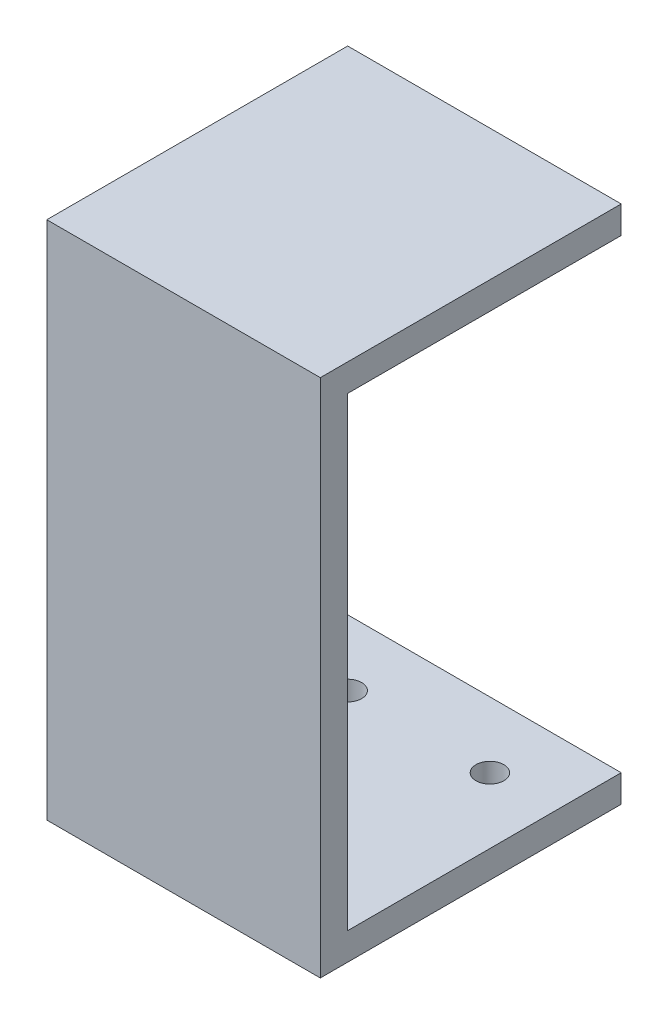
ISO-10303-21;
HEADER;
FILE_DESCRIPTION(('STEP AP214'),'2;1');
FILE_NAME('part.step','',(''),(''),'','','');
FILE_SCHEMA(('AUTOMOTIVE_DESIGN { 1 0 10303 214 1 1 1 1 }'));
ENDSEC;
DATA;
#1=APPLICATION_CONTEXT('core data for automotive mechanical design processes');
#2=APPLICATION_PROTOCOL_DEFINITION('international standard','automotive_design',2000,#1);
#3=PRODUCT_CONTEXT('',#1,'mechanical');
#4=PRODUCT('Part','Part','',(#3));
#5=PRODUCT_RELATED_PRODUCT_CATEGORY('part','',(#4));
#6=PRODUCT_DEFINITION_FORMATION('','',#4);
#7=PRODUCT_DEFINITION_CONTEXT('part definition',#1,'design');
#8=PRODUCT_DEFINITION('design','',#6,#7);
#9=PRODUCT_DEFINITION_SHAPE('','',#8);
#10=(LENGTH_UNIT() NAMED_UNIT(*) SI_UNIT(.MILLI.,.METRE.));
#11=(NAMED_UNIT(*) PLANE_ANGLE_UNIT() SI_UNIT($,.RADIAN.));
#12=(NAMED_UNIT(*) SI_UNIT($,.STERADIAN.) SOLID_ANGLE_UNIT());
#13=UNCERTAINTY_MEASURE_WITH_UNIT(LENGTH_MEASURE(1.E-05),#10,'distance_accuracy_value','');
#14=(GEOMETRIC_REPRESENTATION_CONTEXT(3) GLOBAL_UNCERTAINTY_ASSIGNED_CONTEXT((#13)) GLOBAL_UNIT_ASSIGNED_CONTEXT((#10,
#11,#12)) REPRESENTATION_CONTEXT('',''));
#15=CARTESIAN_POINT('',(0.,0.,0.));
#16=DIRECTION('',(0.,0.,1.));
#17=DIRECTION('',(1.,0.,0.));
#18=AXIS2_PLACEMENT_3D('',#15,#16,#17);
#19=CARTESIAN_POINT('',(0.,0.,0.));
#20=DIRECTION('',(0.,0.,1.));
#21=DIRECTION('',(1.,0.,0.));
#22=AXIS2_PLACEMENT_3D('',#19,#20,#21);
#23=PLANE('',#22);
#24=DIRECTION('',(-1.,0.,0.));
#25=VECTOR('',#24,1.);
#26=CARTESIAN_POINT('',(25.,42.52,0.));
#27=LINE('',#26,#25);
#28=CARTESIAN_POINT('',(25.,42.52,0.));
#29=VERTEX_POINT('',#28);
#30=CARTESIAN_POINT('',(-25.,42.52,0.));
#31=VERTEX_POINT('',#30);
#32=EDGE_CURVE('E61',#29,#31,#27,.T.);
#33=ORIENTED_EDGE('',*,*,#32,.F.);
#34=DIRECTION('',(0.,1.,0.));
#35=VECTOR('',#34,1.);
#36=CARTESIAN_POINT('',(25.,47.52,0.));
#37=LINE('',#36,#35);
#38=CARTESIAN_POINT('',(25.,-42.52,0.));
#39=VERTEX_POINT('',#38);
#40=EDGE_CURVE('E129',#39,#29,#37,.T.);
#41=ORIENTED_EDGE('',*,*,#40,.F.);
#42=DIRECTION('',(1.,0.,0.));
#43=VECTOR('',#42,1.);
#44=CARTESIAN_POINT('',(25.,-42.52,0.));
#45=LINE('',#44,#43);
#46=CARTESIAN_POINT('',(-25.,-42.52,0.));
#47=VERTEX_POINT('',#46);
#48=EDGE_CURVE('E56',#47,#39,#45,.T.);
#49=ORIENTED_EDGE('',*,*,#48,.F.);
#50=DIRECTION('',(0.,-1.,0.));
#51=VECTOR('',#50,1.);
#52=CARTESIAN_POINT('',(-25.,47.52,0.));
#53=LINE('',#52,#51);
#54=EDGE_CURVE('E132',#31,#47,#53,.T.);
#55=ORIENTED_EDGE('',*,*,#54,.F.);
#56=EDGE_LOOP('',(#33,#41,#49,#55));
#57=FACE_BOUND('',#56,.T.);
#58=ADVANCED_FACE('F43',(#57),#23,.F.);
#59=CARTESIAN_POINT('',(25.,47.52,5.));
#60=DIRECTION('',(-1.,0.,0.));
#61=DIRECTION('',(0.,-1.,0.));
#62=AXIS2_PLACEMENT_3D('',#59,#60,#61);
#63=PLANE('',#62);
#64=DIRECTION('',(0.,0.,-1.));
#65=VECTOR('',#64,1.);
#66=CARTESIAN_POINT('',(25.,-47.52,5.));
#67=LINE('',#66,#65);
#68=CARTESIAN_POINT('',(25.,-47.52,5.));
#69=VERTEX_POINT('',#68);
#70=CARTESIAN_POINT('',(25.,-47.52,-50.));
#71=VERTEX_POINT('',#70);
#72=EDGE_CURVE('E161',#69,#71,#67,.T.);
#73=ORIENTED_EDGE('',*,*,#72,.T.);
#74=DIRECTION('',(0.,-1.,0.));
#75=VECTOR('',#74,1.);
#76=CARTESIAN_POINT('',(25.,-47.52,-50.));
#77=LINE('',#76,#75);
#78=CARTESIAN_POINT('',(25.,-42.52,-50.));
#79=VERTEX_POINT('',#78);
#80=EDGE_CURVE('E142',#79,#71,#77,.T.);
#81=ORIENTED_EDGE('',*,*,#80,.F.);
#82=DIRECTION('',(0.,0.,1.));
#83=VECTOR('',#82,1.);
#84=CARTESIAN_POINT('',(25.,-42.52,-50.));
#85=LINE('',#84,#83);
#86=EDGE_CURVE('E137',#79,#39,#85,.T.);
#87=ORIENTED_EDGE('',*,*,#86,.T.);
#88=ORIENTED_EDGE('',*,*,#40,.T.);
#89=DIRECTION('',(0.,0.,1.));
#90=VECTOR('',#89,1.);
#91=CARTESIAN_POINT('',(25.,42.52,-50.));
#92=LINE('',#91,#90);
#93=CARTESIAN_POINT('',(25.,42.52,-50.));
#94=VERTEX_POINT('',#93);
#95=EDGE_CURVE('E112',#94,#29,#92,.T.);
#96=ORIENTED_EDGE('',*,*,#95,.F.);
#97=DIRECTION('',(0.,-1.,0.));
#98=VECTOR('',#97,1.);
#99=CARTESIAN_POINT('',(25.,47.52,-50.));
#100=LINE('',#99,#98);
#101=CARTESIAN_POINT('',(25.,47.52,-50.));
#102=VERTEX_POINT('',#101);
#103=EDGE_CURVE('E120',#102,#94,#100,.T.);
#104=ORIENTED_EDGE('',*,*,#103,.F.);
#105=DIRECTION('',(0.,0.,-1.));
#106=VECTOR('',#105,1.);
#107=CARTESIAN_POINT('',(25.,47.52,5.));
#108=LINE('',#107,#106);
#109=CARTESIAN_POINT('',(25.,47.52,5.));
#110=VERTEX_POINT('',#109);
#111=EDGE_CURVE('E11',#110,#102,#108,.T.);
#112=ORIENTED_EDGE('',*,*,#111,.F.);
#113=DIRECTION('',(0.,1.,0.));
#114=VECTOR('',#113,1.);
#115=CARTESIAN_POINT('',(25.,47.52,5.));
#116=LINE('',#115,#114);
#117=EDGE_CURVE('E153',#69,#110,#116,.T.);
#118=ORIENTED_EDGE('',*,*,#117,.F.);
#119=EDGE_LOOP('',(#73,#81,#87,#88,#96,#104,#112,#118));
#120=FACE_BOUND('',#119,.T.);
#121=ADVANCED_FACE('F44',(#120),#63,.F.);
#122=CARTESIAN_POINT('',(-25.,47.52,5.));
#123=DIRECTION('',(0.,-1.,0.));
#124=DIRECTION('',(0.,0.,-1.));
#125=AXIS2_PLACEMENT_3D('',#122,#123,#124);
#126=PLANE('',#125);
#127=ORIENTED_EDGE('',*,*,#111,.T.);
#128=DIRECTION('',(1.,0.,0.));
#129=VECTOR('',#128,1.);
#130=CARTESIAN_POINT('',(25.,47.52,-50.));
#131=LINE('',#130,#129);
#132=CARTESIAN_POINT('',(-25.,47.52,-50.));
#133=VERTEX_POINT('',#132);
#134=EDGE_CURVE('E122',#133,#102,#131,.T.);
#135=ORIENTED_EDGE('',*,*,#134,.F.);
#136=DIRECTION('',(0.,0.,-1.));
#137=VECTOR('',#136,1.);
#138=CARTESIAN_POINT('',(-25.,47.52,5.));
#139=LINE('',#138,#137);
#140=CARTESIAN_POINT('',(-25.,47.52,5.));
#141=VERTEX_POINT('',#140);
#142=EDGE_CURVE('E55',#141,#133,#139,.T.);
#143=ORIENTED_EDGE('',*,*,#142,.F.);
#144=DIRECTION('',(-1.,0.,0.));
#145=VECTOR('',#144,1.);
#146=CARTESIAN_POINT('',(-25.,47.52,5.));
#147=LINE('',#146,#145);
#148=EDGE_CURVE('E156',#110,#141,#147,.T.);
#149=ORIENTED_EDGE('',*,*,#148,.F.);
#150=EDGE_LOOP('',(#127,#135,#143,#149));
#151=FACE_BOUND('',#150,.T.);
#152=ADVANCED_FACE('F171',(#151),#126,.F.);
#153=CARTESIAN_POINT('',(-25.,47.52,5.));
#154=DIRECTION('',(1.,0.,0.));
#155=DIRECTION('',(0.,1.,0.));
#156=AXIS2_PLACEMENT_3D('',#153,#154,#155);
#157=PLANE('',#156);
#158=ORIENTED_EDGE('',*,*,#142,.T.);
#159=DIRECTION('',(0.,1.,0.));
#160=VECTOR('',#159,1.);
#161=CARTESIAN_POINT('',(-25.,47.52,-50.));
#162=LINE('',#161,#160);
#163=CARTESIAN_POINT('',(-25.,42.52,-50.));
#164=VERTEX_POINT('',#163);
#165=EDGE_CURVE('E119',#164,#133,#162,.T.);
#166=ORIENTED_EDGE('',*,*,#165,.F.);
#167=DIRECTION('',(0.,0.,1.));
#168=VECTOR('',#167,1.);
#169=CARTESIAN_POINT('',(-25.,42.52,-50.));
#170=LINE('',#169,#168);
#171=EDGE_CURVE('E114',#164,#31,#170,.T.);
#172=ORIENTED_EDGE('',*,*,#171,.T.);
#173=ORIENTED_EDGE('',*,*,#54,.T.);
#174=DIRECTION('',(0.,0.,1.));
#175=VECTOR('',#174,1.);
#176=CARTESIAN_POINT('',(-25.,-42.52,-50.));
#177=LINE('',#176,#175);
#178=CARTESIAN_POINT('',(-25.,-42.52,-50.));
#179=VERTEX_POINT('',#178);
#180=EDGE_CURVE('E136',#179,#47,#177,.T.);
#181=ORIENTED_EDGE('',*,*,#180,.F.);
#182=DIRECTION('',(0.,1.,0.));
#183=VECTOR('',#182,1.);
#184=CARTESIAN_POINT('',(-25.,-47.52,-50.));
#185=LINE('',#184,#183);
#186=CARTESIAN_POINT('',(-25.,-47.52,-50.));
#187=VERTEX_POINT('',#186);
#188=EDGE_CURVE('E149',#187,#179,#185,.T.);
#189=ORIENTED_EDGE('',*,*,#188,.F.);
#190=DIRECTION('',(0.,0.,-1.));
#191=VECTOR('',#190,1.);
#192=CARTESIAN_POINT('',(-25.,-47.52,5.));
#193=LINE('',#192,#191);
#194=CARTESIAN_POINT('',(-25.,-47.52,5.));
#195=VERTEX_POINT('',#194);
#196=EDGE_CURVE('E164',#195,#187,#193,.T.);
#197=ORIENTED_EDGE('',*,*,#196,.F.);
#198=DIRECTION('',(0.,-1.,0.));
#199=VECTOR('',#198,1.);
#200=CARTESIAN_POINT('',(-25.,47.52,5.));
#201=LINE('',#200,#199);
#202=EDGE_CURVE('E158',#141,#195,#201,.T.);
#203=ORIENTED_EDGE('',*,*,#202,.F.);
#204=EDGE_LOOP('',(#158,#166,#172,#173,#181,#189,#197,#203));
#205=FACE_BOUND('',#204,.T.);
#206=ADVANCED_FACE('F168',(#205),#157,.F.);
#207=CARTESIAN_POINT('',(-25.,-47.52,5.));
#208=DIRECTION('',(0.,1.,0.));
#209=DIRECTION('',(0.,0.,1.));
#210=AXIS2_PLACEMENT_3D('',#207,#208,#209);
#211=PLANE('',#210);
#212=CARTESIAN_POINT('',(-13.,-47.52,-7.));
#213=DIRECTION('',(0.,-1.,0.));
#214=DIRECTION('',(0.,0.,-1.));
#215=AXIS2_PLACEMENT_3D('',#212,#213,#214);
#216=CIRCLE('',#215,2.55269999999999);
#217=CARTESIAN_POINT('',(-13.,-47.52,-9.55269999999999));
#218=VERTEX_POINT('',#217);
#219=EDGE_CURVE('E345',#218,#218,#216,.T.);
#220=ORIENTED_EDGE('',*,*,#219,.F.);
#221=EDGE_LOOP('',(#220));
#222=FACE_BOUND('',#221,.T.);
#223=CARTESIAN_POINT('',(-13.,-47.52,-38.));
#224=DIRECTION('',(0.,-1.,0.));
#225=DIRECTION('',(0.,0.,-1.));
#226=AXIS2_PLACEMENT_3D('',#223,#224,#225);
#227=CIRCLE('',#226,2.55269999999999);
#228=CARTESIAN_POINT('',(-13.,-47.52,-40.5527));
#229=VERTEX_POINT('',#228);
#230=EDGE_CURVE('E347',#229,#229,#227,.T.);
#231=ORIENTED_EDGE('',*,*,#230,.F.);
#232=EDGE_LOOP('',(#231));
#233=FACE_BOUND('',#232,.T.);
#234=CARTESIAN_POINT('',(13.,-47.52,-38.));
#235=DIRECTION('',(0.,-1.,0.));
#236=DIRECTION('',(0.,0.,-1.));
#237=AXIS2_PLACEMENT_3D('',#234,#235,#236);
#238=CIRCLE('',#237,2.55269999999999);
#239=CARTESIAN_POINT('',(13.,-47.52,-40.5527));
#240=VERTEX_POINT('',#239);
#241=EDGE_CURVE('E353',#240,#240,#238,.T.);
#242=ORIENTED_EDGE('',*,*,#241,.F.);
#243=EDGE_LOOP('',(#242));
#244=FACE_BOUND('',#243,.T.);
#245=CARTESIAN_POINT('',(13.,-47.52,-7.));
#246=DIRECTION('',(0.,-1.,0.));
#247=DIRECTION('',(0.,0.,-1.));
#248=AXIS2_PLACEMENT_3D('',#245,#246,#247);
#249=CIRCLE('',#248,2.55269999999999);
#250=CARTESIAN_POINT('',(13.,-47.52,-9.55269999999999));
#251=VERTEX_POINT('',#250);
#252=EDGE_CURVE('E358',#251,#251,#249,.T.);
#253=ORIENTED_EDGE('',*,*,#252,.F.);
#254=EDGE_LOOP('',(#253));
#255=FACE_BOUND('',#254,.T.);
#256=ORIENTED_EDGE('',*,*,#196,.T.);
#257=DIRECTION('',(-1.,0.,0.));
#258=VECTOR('',#257,1.);
#259=CARTESIAN_POINT('',(25.,-47.52,-50.));
#260=LINE('',#259,#258);
#261=EDGE_CURVE('E145',#71,#187,#260,.T.);
#262=ORIENTED_EDGE('',*,*,#261,.F.);
#263=ORIENTED_EDGE('',*,*,#72,.F.);
#264=DIRECTION('',(1.,0.,0.));
#265=VECTOR('',#264,1.);
#266=CARTESIAN_POINT('',(-25.,-47.52,5.));
#267=LINE('',#266,#265);
#268=EDGE_CURVE('E159',#195,#69,#267,.T.);
#269=ORIENTED_EDGE('',*,*,#268,.F.);
#270=EDGE_LOOP('',(#256,#262,#263,#269));
#271=FACE_BOUND('',#270,.T.);
#272=ADVANCED_FACE('F186',(#222,#233,#244,#255,#271),#211,.F.);
#273=CARTESIAN_POINT('',(0.,0.,5.));
#274=DIRECTION('',(0.,0.,1.));
#275=DIRECTION('',(1.,0.,0.));
#276=AXIS2_PLACEMENT_3D('',#273,#274,#275);
#277=PLANE('',#276);
#278=ORIENTED_EDGE('',*,*,#117,.T.);
#279=ORIENTED_EDGE('',*,*,#148,.T.);
#280=ORIENTED_EDGE('',*,*,#202,.T.);
#281=ORIENTED_EDGE('',*,*,#268,.T.);
#282=EDGE_LOOP('',(#278,#279,#280,#281));
#283=FACE_BOUND('',#282,.T.);
#284=ADVANCED_FACE('F195',(#283),#277,.T.);
#285=CARTESIAN_POINT('',(25.,-42.52,-50.));
#286=DIRECTION('',(0.,-1.,0.));
#287=DIRECTION('',(0.,0.,-1.));
#288=AXIS2_PLACEMENT_3D('',#285,#286,#287);
#289=PLANE('',#288);
#290=CARTESIAN_POINT('',(-13.,-42.52,-7.));
#291=DIRECTION('',(0.,-1.,0.));
#292=DIRECTION('',(0.,0.,-1.));
#293=AXIS2_PLACEMENT_3D('',#290,#291,#292);
#294=CIRCLE('',#293,2.55269999999999);
#295=CARTESIAN_POINT('',(-13.,-42.52,-9.55269999999999));
#296=VERTEX_POINT('',#295);
#297=EDGE_CURVE('E344',#296,#296,#294,.T.);
#298=ORIENTED_EDGE('',*,*,#297,.T.);
#299=EDGE_LOOP('',(#298));
#300=FACE_BOUND('',#299,.T.);
#301=CARTESIAN_POINT('',(-13.,-42.52,-38.));
#302=DIRECTION('',(0.,-1.,0.));
#303=DIRECTION('',(0.,0.,-1.));
#304=AXIS2_PLACEMENT_3D('',#301,#302,#303);
#305=CIRCLE('',#304,2.55269999999999);
#306=CARTESIAN_POINT('',(-13.,-42.52,-40.5527));
#307=VERTEX_POINT('',#306);
#308=EDGE_CURVE('E349',#307,#307,#305,.T.);
#309=ORIENTED_EDGE('',*,*,#308,.T.);
#310=EDGE_LOOP('',(#309));
#311=FACE_BOUND('',#310,.T.);
#312=CARTESIAN_POINT('',(13.,-42.52,-38.));
#313=DIRECTION('',(0.,-1.,0.));
#314=DIRECTION('',(0.,0.,-1.));
#315=AXIS2_PLACEMENT_3D('',#312,#313,#314);
#316=CIRCLE('',#315,2.55269999999999);
#317=CARTESIAN_POINT('',(13.,-42.52,-40.5527));
#318=VERTEX_POINT('',#317);
#319=EDGE_CURVE('E50',#318,#318,#316,.T.);
#320=ORIENTED_EDGE('',*,*,#319,.T.);
#321=EDGE_LOOP('',(#320));
#322=FACE_BOUND('',#321,.T.);
#323=CARTESIAN_POINT('',(13.,-42.52,-7.));
#324=DIRECTION('',(0.,-1.,0.));
#325=DIRECTION('',(0.,0.,-1.));
#326=AXIS2_PLACEMENT_3D('',#323,#324,#325);
#327=CIRCLE('',#326,2.55269999999999);
#328=CARTESIAN_POINT('',(13.,-42.52,-9.55269999999999));
#329=VERTEX_POINT('',#328);
#330=EDGE_CURVE('E139',#329,#329,#327,.T.);
#331=ORIENTED_EDGE('',*,*,#330,.T.);
#332=EDGE_LOOP('',(#331));
#333=FACE_BOUND('',#332,.T.);
#334=ORIENTED_EDGE('',*,*,#48,.T.);
#335=ORIENTED_EDGE('',*,*,#86,.F.);
#336=DIRECTION('',(1.,0.,0.));
#337=VECTOR('',#336,1.);
#338=CARTESIAN_POINT('',(25.,-42.52,-50.));
#339=LINE('',#338,#337);
#340=EDGE_CURVE('E150',#179,#79,#339,.T.);
#341=ORIENTED_EDGE('',*,*,#340,.F.);
#342=ORIENTED_EDGE('',*,*,#180,.T.);
#343=EDGE_LOOP('',(#334,#335,#341,#342));
#344=FACE_BOUND('',#343,.T.);
#345=ADVANCED_FACE('F179',(#300,#311,#322,#333,#344),#289,.F.);
#346=CARTESIAN_POINT('',(0.,0.,-50.));
#347=DIRECTION('',(0.,0.,-1.));
#348=DIRECTION('',(-1.,0.,0.));
#349=AXIS2_PLACEMENT_3D('',#346,#347,#348);
#350=PLANE('',#349);
#351=ORIENTED_EDGE('',*,*,#261,.T.);
#352=ORIENTED_EDGE('',*,*,#188,.T.);
#353=ORIENTED_EDGE('',*,*,#340,.T.);
#354=ORIENTED_EDGE('',*,*,#80,.T.);
#355=EDGE_LOOP('',(#351,#352,#353,#354));
#356=FACE_BOUND('',#355,.T.);
#357=ADVANCED_FACE('F184',(#356),#350,.T.);
#358=CARTESIAN_POINT('',(25.,42.52,-50.));
#359=DIRECTION('',(0.,1.,0.));
#360=DIRECTION('',(0.,0.,1.));
#361=AXIS2_PLACEMENT_3D('',#358,#359,#360);
#362=PLANE('',#361);
#363=ORIENTED_EDGE('',*,*,#32,.T.);
#364=ORIENTED_EDGE('',*,*,#171,.F.);
#365=DIRECTION('',(-1.,0.,0.));
#366=VECTOR('',#365,1.);
#367=CARTESIAN_POINT('',(25.,42.52,-50.));
#368=LINE('',#367,#366);
#369=EDGE_CURVE('E110',#94,#164,#368,.T.);
#370=ORIENTED_EDGE('',*,*,#369,.F.);
#371=ORIENTED_EDGE('',*,*,#95,.T.);
#372=EDGE_LOOP('',(#363,#364,#370,#371));
#373=FACE_BOUND('',#372,.T.);
#374=ADVANCED_FACE('F108',(#373),#362,.F.);
#375=CARTESIAN_POINT('',(0.,0.,-50.));
#376=DIRECTION('',(0.,0.,-1.));
#377=DIRECTION('',(-1.,0.,0.));
#378=AXIS2_PLACEMENT_3D('',#375,#376,#377);
#379=PLANE('',#378);
#380=ORIENTED_EDGE('',*,*,#103,.T.);
#381=ORIENTED_EDGE('',*,*,#369,.T.);
#382=ORIENTED_EDGE('',*,*,#165,.T.);
#383=ORIENTED_EDGE('',*,*,#134,.T.);
#384=EDGE_LOOP('',(#380,#381,#382,#383));
#385=FACE_BOUND('',#384,.T.);
#386=ADVANCED_FACE('F125',(#385),#379,.T.);
#387=CARTESIAN_POINT('',(13.,-47.52,-7.));
#388=DIRECTION('',(0.,-1.,0.));
#389=DIRECTION('',(0.,0.,-1.));
#390=AXIS2_PLACEMENT_3D('',#387,#388,#389);
#391=CYLINDRICAL_SURFACE('',#390,2.55269999999999);
#392=ORIENTED_EDGE('',*,*,#252,.T.);
#393=EDGE_LOOP('',(#392));
#394=FACE_BOUND('',#393,.T.);
#395=ORIENTED_EDGE('',*,*,#330,.F.);
#396=EDGE_LOOP('',(#395));
#397=FACE_BOUND('',#396,.T.);
#398=ADVANCED_FACE('F244',(#394,#397),#391,.F.);
#399=CARTESIAN_POINT('',(13.,-47.52,-38.));
#400=DIRECTION('',(0.,-1.,0.));
#401=DIRECTION('',(0.,0.,-1.));
#402=AXIS2_PLACEMENT_3D('',#399,#400,#401);
#403=CYLINDRICAL_SURFACE('',#402,2.55269999999999);
#404=ORIENTED_EDGE('',*,*,#241,.T.);
#405=EDGE_LOOP('',(#404));
#406=FACE_BOUND('',#405,.T.);
#407=ORIENTED_EDGE('',*,*,#319,.F.);
#408=EDGE_LOOP('',(#407));
#409=FACE_BOUND('',#408,.T.);
#410=ADVANCED_FACE('F257',(#406,#409),#403,.F.);
#411=CARTESIAN_POINT('',(-13.,-47.52,-38.));
#412=DIRECTION('',(0.,-1.,0.));
#413=DIRECTION('',(0.,0.,-1.));
#414=AXIS2_PLACEMENT_3D('',#411,#412,#413);
#415=CYLINDRICAL_SURFACE('',#414,2.55269999999999);
#416=ORIENTED_EDGE('',*,*,#230,.T.);
#417=EDGE_LOOP('',(#416));
#418=FACE_BOUND('',#417,.T.);
#419=ORIENTED_EDGE('',*,*,#308,.F.);
#420=EDGE_LOOP('',(#419));
#421=FACE_BOUND('',#420,.T.);
#422=ADVANCED_FACE('F271',(#418,#421),#415,.F.);
#423=CARTESIAN_POINT('',(-13.,-47.52,-7.));
#424=DIRECTION('',(0.,-1.,0.));
#425=DIRECTION('',(0.,0.,-1.));
#426=AXIS2_PLACEMENT_3D('',#423,#424,#425);
#427=CYLINDRICAL_SURFACE('',#426,2.55269999999999);
#428=ORIENTED_EDGE('',*,*,#219,.T.);
#429=EDGE_LOOP('',(#428));
#430=FACE_BOUND('',#429,.T.);
#431=ORIENTED_EDGE('',*,*,#297,.F.);
#432=EDGE_LOOP('',(#431));
#433=FACE_BOUND('',#432,.T.);
#434=ADVANCED_FACE('F284',(#430,#433),#427,.F.);
#435=CLOSED_SHELL('',(#58,#121,#152,#206,#272,#284,#345,#357,#374,#386,#398,#410,#422,#434));
#436=MANIFOLD_SOLID_BREP('B2',#435);
#437=ADVANCED_BREP_SHAPE_REPRESENTATION('',(#18,#436),#14);
#438=SHAPE_DEFINITION_REPRESENTATION(#9,#437);
ENDSEC;
END-ISO-10303-21;
